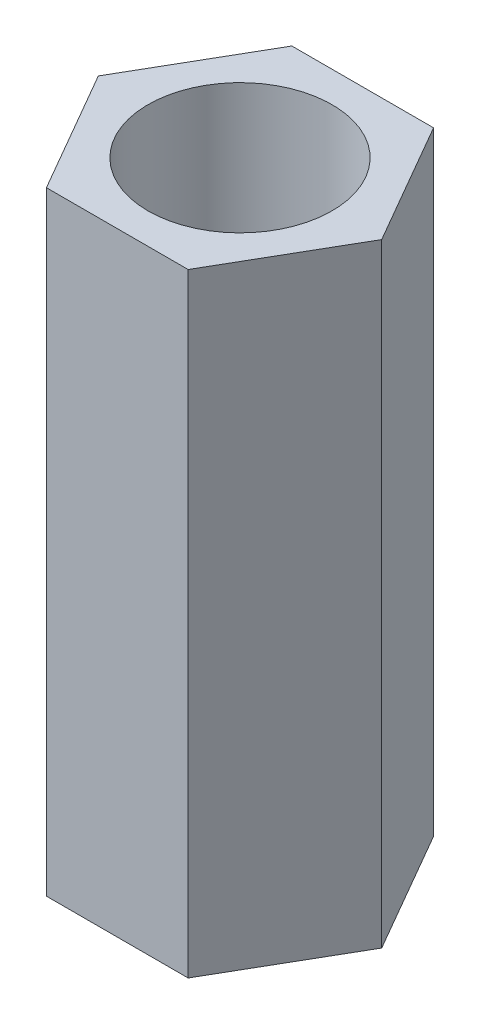
ISO-10303-21;
HEADER;
FILE_DESCRIPTION(('STEP AP214'),'2;1');
FILE_NAME('part.step','',(''),(''),'','','');
FILE_SCHEMA(('AUTOMOTIVE_DESIGN { 1 0 10303 214 1 1 1 1 }'));
ENDSEC;
DATA;
#1=APPLICATION_CONTEXT('core data for automotive mechanical design processes');
#2=APPLICATION_PROTOCOL_DEFINITION('international standard','automotive_design',2000,#1);
#3=PRODUCT_CONTEXT('',#1,'mechanical');
#4=PRODUCT('Part','Part','',(#3));
#5=PRODUCT_RELATED_PRODUCT_CATEGORY('part','',(#4));
#6=PRODUCT_DEFINITION_FORMATION('','',#4);
#7=PRODUCT_DEFINITION_CONTEXT('part definition',#1,'design');
#8=PRODUCT_DEFINITION('design','',#6,#7);
#9=PRODUCT_DEFINITION_SHAPE('','',#8);
#10=(LENGTH_UNIT() NAMED_UNIT(*) SI_UNIT(.MILLI.,.METRE.));
#11=(NAMED_UNIT(*) PLANE_ANGLE_UNIT() SI_UNIT($,.RADIAN.));
#12=(NAMED_UNIT(*) SI_UNIT($,.STERADIAN.) SOLID_ANGLE_UNIT());
#13=UNCERTAINTY_MEASURE_WITH_UNIT(LENGTH_MEASURE(1.E-05),#10,'distance_accuracy_value','');
#14=(GEOMETRIC_REPRESENTATION_CONTEXT(3) GLOBAL_UNCERTAINTY_ASSIGNED_CONTEXT((#13)) GLOBAL_UNIT_ASSIGNED_CONTEXT((#10,
#11,#12)) REPRESENTATION_CONTEXT('',''));
#15=CARTESIAN_POINT('',(0.,0.,0.));
#16=DIRECTION('',(0.,0.,1.));
#17=DIRECTION('',(1.,0.,0.));
#18=AXIS2_PLACEMENT_3D('',#15,#16,#17);
#19=CARTESIAN_POINT('',(1.15470053837927,10.,1.99999999999998));
#20=DIRECTION('',(-0.866025403784442,0.,-0.499999999999995));
#21=DIRECTION('',(-0.499999999999995,0.,0.866025403784442));
#22=AXIS2_PLACEMENT_3D('',#19,#20,#21);
#23=PLANE('',#22);
#24=DIRECTION('',(0.499999999999995,0.,-0.866025403784442));
#25=VECTOR('',#24,1.);
#26=CARTESIAN_POINT('',(1.15470053837927,0.,1.99999999999998));
#27=LINE('',#26,#25);
#28=CARTESIAN_POINT('',(1.15470053837927,0.,1.99999999999998));
#29=VERTEX_POINT('',#28);
#30=CARTESIAN_POINT('',(2.3094010767585,0.,0.));
#31=VERTEX_POINT('',#30);
#32=EDGE_CURVE('E118',#29,#31,#27,.T.);
#33=ORIENTED_EDGE('',*,*,#32,.T.);
#34=DIRECTION('',(0.,-1.,0.));
#35=VECTOR('',#34,1.);
#36=CARTESIAN_POINT('',(2.3094010767585,10.,0.));
#37=LINE('',#36,#35);
#38=CARTESIAN_POINT('',(2.3094010767585,10.,0.));
#39=VERTEX_POINT('',#38);
#40=EDGE_CURVE('E11',#39,#31,#37,.T.);
#41=ORIENTED_EDGE('',*,*,#40,.F.);
#42=DIRECTION('',(0.499999999999995,0.,-0.866025403784442));
#43=VECTOR('',#42,1.);
#44=CARTESIAN_POINT('',(1.15470053837927,10.,1.99999999999998));
#45=LINE('',#44,#43);
#46=CARTESIAN_POINT('',(1.15470053837927,10.,1.99999999999998));
#47=VERTEX_POINT('',#46);
#48=EDGE_CURVE('E129',#47,#39,#45,.T.);
#49=ORIENTED_EDGE('',*,*,#48,.F.);
#50=DIRECTION('',(0.,-1.,0.));
#51=VECTOR('',#50,1.);
#52=CARTESIAN_POINT('',(1.15470053837927,10.,1.99999999999998));
#53=LINE('',#52,#51);
#54=EDGE_CURVE('E114',#47,#29,#53,.T.);
#55=ORIENTED_EDGE('',*,*,#54,.T.);
#56=EDGE_LOOP('',(#33,#41,#49,#55));
#57=FACE_BOUND('',#56,.T.);
#58=ADVANCED_FACE('F34',(#57),#23,.F.);
#59=CARTESIAN_POINT('',(2.3094010767585,10.,0.));
#60=DIRECTION('',(-0.866025403784438,0.,0.500000000000001));
#61=DIRECTION('',(0.500000000000001,0.,0.866025403784438));
#62=AXIS2_PLACEMENT_3D('',#59,#60,#61);
#63=PLANE('',#62);
#64=DIRECTION('',(-0.500000000000001,0.,-0.866025403784438));
#65=VECTOR('',#64,1.);
#66=CARTESIAN_POINT('',(2.3094010767585,0.,0.));
#67=LINE('',#66,#65);
#68=CARTESIAN_POINT('',(1.15470053837924,0.,-2.));
#69=VERTEX_POINT('',#68);
#70=EDGE_CURVE('E121',#31,#69,#67,.T.);
#71=ORIENTED_EDGE('',*,*,#70,.T.);
#72=DIRECTION('',(0.,-1.,0.));
#73=VECTOR('',#72,1.);
#74=CARTESIAN_POINT('',(1.15470053837924,10.,-2.));
#75=LINE('',#74,#73);
#76=CARTESIAN_POINT('',(1.15470053837924,10.,-2.));
#77=VERTEX_POINT('',#76);
#78=EDGE_CURVE('E42',#77,#69,#75,.T.);
#79=ORIENTED_EDGE('',*,*,#78,.F.);
#80=DIRECTION('',(-0.500000000000001,0.,-0.866025403784438));
#81=VECTOR('',#80,1.);
#82=CARTESIAN_POINT('',(2.3094010767585,10.,0.));
#83=LINE('',#82,#81);
#84=EDGE_CURVE('E87',#39,#77,#83,.T.);
#85=ORIENTED_EDGE('',*,*,#84,.F.);
#86=ORIENTED_EDGE('',*,*,#40,.T.);
#87=EDGE_LOOP('',(#71,#79,#85,#86));
#88=FACE_BOUND('',#87,.T.);
#89=ADVANCED_FACE('F154',(#88),#63,.F.);
#90=CARTESIAN_POINT('',(1.15470053837924,10.,-2.));
#91=DIRECTION('',(0.,0.,1.));
#92=DIRECTION('',(1.,0.,0.));
#93=AXIS2_PLACEMENT_3D('',#90,#91,#92);
#94=PLANE('',#93);
#95=DIRECTION('',(-1.,0.,0.));
#96=VECTOR('',#95,1.);
#97=CARTESIAN_POINT('',(1.15470053837924,0.,-2.));
#98=LINE('',#97,#96);
#99=CARTESIAN_POINT('',(-1.15470053837926,0.,-1.99999999999999));
#100=VERTEX_POINT('',#99);
#101=EDGE_CURVE('E124',#69,#100,#98,.T.);
#102=ORIENTED_EDGE('',*,*,#101,.T.);
#103=DIRECTION('',(0.,-1.,0.));
#104=VECTOR('',#103,1.);
#105=CARTESIAN_POINT('',(-1.15470053837926,10.,-1.99999999999999));
#106=LINE('',#105,#104);
#107=CARTESIAN_POINT('',(-1.15470053837926,10.,-1.99999999999999));
#108=VERTEX_POINT('',#107);
#109=EDGE_CURVE('E109',#108,#100,#106,.T.);
#110=ORIENTED_EDGE('',*,*,#109,.F.);
#111=DIRECTION('',(-1.,0.,0.));
#112=VECTOR('',#111,1.);
#113=CARTESIAN_POINT('',(1.15470053837924,10.,-2.));
#114=LINE('',#113,#112);
#115=EDGE_CURVE('E100',#77,#108,#114,.T.);
#116=ORIENTED_EDGE('',*,*,#115,.F.);
#117=ORIENTED_EDGE('',*,*,#78,.T.);
#118=EDGE_LOOP('',(#102,#110,#116,#117));
#119=FACE_BOUND('',#118,.T.);
#120=ADVANCED_FACE('F135',(#119),#94,.F.);
#121=CARTESIAN_POINT('',(-1.15470053837926,10.,-1.99999999999999));
#122=DIRECTION('',(0.866025403784442,0.,0.499999999999995));
#123=DIRECTION('',(0.499999999999995,0.,-0.866025403784442));
#124=AXIS2_PLACEMENT_3D('',#121,#122,#123);
#125=PLANE('',#124);
#126=DIRECTION('',(-0.499999999999995,0.,0.866025403784442));
#127=VECTOR('',#126,1.);
#128=CARTESIAN_POINT('',(-1.15470053837926,0.,-1.99999999999999));
#129=LINE('',#128,#127);
#130=CARTESIAN_POINT('',(-2.3094010767585,0.,0.));
#131=VERTEX_POINT('',#130);
#132=EDGE_CURVE('E108',#100,#131,#129,.T.);
#133=ORIENTED_EDGE('',*,*,#132,.T.);
#134=DIRECTION('',(0.,-1.,0.));
#135=VECTOR('',#134,1.);
#136=CARTESIAN_POINT('',(-2.3094010767585,10.,0.));
#137=LINE('',#136,#135);
#138=CARTESIAN_POINT('',(-2.3094010767585,10.,0.));
#139=VERTEX_POINT('',#138);
#140=EDGE_CURVE('E105',#139,#131,#137,.T.);
#141=ORIENTED_EDGE('',*,*,#140,.F.);
#142=DIRECTION('',(-0.499999999999995,0.,0.866025403784442));
#143=VECTOR('',#142,1.);
#144=CARTESIAN_POINT('',(-1.15470053837926,10.,-1.99999999999999));
#145=LINE('',#144,#143);
#146=EDGE_CURVE('E94',#108,#139,#145,.T.);
#147=ORIENTED_EDGE('',*,*,#146,.F.);
#148=ORIENTED_EDGE('',*,*,#109,.T.);
#149=EDGE_LOOP('',(#133,#141,#147,#148));
#150=FACE_BOUND('',#149,.T.);
#151=ADVANCED_FACE('F106',(#150),#125,.F.);
#152=CARTESIAN_POINT('',(-2.3094010767585,10.,0.));
#153=DIRECTION('',(0.866025403784435,0.,-0.500000000000007));
#154=DIRECTION('',(-0.500000000000007,0.,-0.866025403784435));
#155=AXIS2_PLACEMENT_3D('',#152,#153,#154);
#156=PLANE('',#155);
#157=DIRECTION('',(0.500000000000007,0.,0.866025403784435));
#158=VECTOR('',#157,1.);
#159=CARTESIAN_POINT('',(-2.3094010767585,0.,0.));
#160=LINE('',#159,#158);
#161=CARTESIAN_POINT('',(-1.15470053837923,0.,2.));
#162=VERTEX_POINT('',#161);
#163=EDGE_CURVE('E73',#131,#162,#160,.T.);
#164=ORIENTED_EDGE('',*,*,#163,.T.);
#165=DIRECTION('',(0.,-1.,0.));
#166=VECTOR('',#165,1.);
#167=CARTESIAN_POINT('',(-1.15470053837923,10.,2.));
#168=LINE('',#167,#166);
#169=CARTESIAN_POINT('',(-1.15470053837923,10.,2.));
#170=VERTEX_POINT('',#169);
#171=EDGE_CURVE('E110',#170,#162,#168,.T.);
#172=ORIENTED_EDGE('',*,*,#171,.F.);
#173=DIRECTION('',(0.500000000000007,0.,0.866025403784435));
#174=VECTOR('',#173,1.);
#175=CARTESIAN_POINT('',(-2.3094010767585,10.,0.));
#176=LINE('',#175,#174);
#177=EDGE_CURVE('E98',#139,#170,#176,.T.);
#178=ORIENTED_EDGE('',*,*,#177,.F.);
#179=ORIENTED_EDGE('',*,*,#140,.T.);
#180=EDGE_LOOP('',(#164,#172,#178,#179));
#181=FACE_BOUND('',#180,.T.);
#182=ADVANCED_FACE('F112',(#181),#156,.F.);
#183=CARTESIAN_POINT('',(-1.15470053837923,10.,2.));
#184=DIRECTION('',(0.,0.,-1.));
#185=DIRECTION('',(-1.,0.,0.));
#186=AXIS2_PLACEMENT_3D('',#183,#184,#185);
#187=PLANE('',#186);
#188=DIRECTION('',(1.,0.,0.));
#189=VECTOR('',#188,1.);
#190=CARTESIAN_POINT('',(-1.15470053837923,0.,2.));
#191=LINE('',#190,#189);
#192=EDGE_CURVE('E79',#162,#29,#191,.T.);
#193=ORIENTED_EDGE('',*,*,#192,.T.);
#194=ORIENTED_EDGE('',*,*,#54,.F.);
#195=DIRECTION('',(1.,0.,0.));
#196=VECTOR('',#195,1.);
#197=CARTESIAN_POINT('',(-1.15470053837923,10.,2.));
#198=LINE('',#197,#196);
#199=EDGE_CURVE('E50',#170,#47,#198,.T.);
#200=ORIENTED_EDGE('',*,*,#199,.F.);
#201=ORIENTED_EDGE('',*,*,#171,.T.);
#202=EDGE_LOOP('',(#193,#194,#200,#201));
#203=FACE_BOUND('',#202,.T.);
#204=ADVANCED_FACE('F142',(#203),#187,.F.);
#205=CARTESIAN_POINT('',(0.,10.,0.));
#206=DIRECTION('',(0.,1.,0.));
#207=DIRECTION('',(0.,0.,1.));
#208=AXIS2_PLACEMENT_3D('',#205,#206,#207);
#209=PLANE('',#208);
#210=CARTESIAN_POINT('',(0.,10.,0.));
#211=DIRECTION('',(0.,1.,0.));
#212=DIRECTION('',(0.,0.,1.));
#213=AXIS2_PLACEMENT_3D('',#210,#211,#212);
#214=CIRCLE('',#213,1.5);
#215=CARTESIAN_POINT('',(0.,10.,1.5));
#216=VERTEX_POINT('',#215);
#217=EDGE_CURVE('E209',#216,#216,#214,.T.);
#218=ORIENTED_EDGE('',*,*,#217,.F.);
#219=EDGE_LOOP('',(#218));
#220=FACE_BOUND('',#219,.T.);
#221=ORIENTED_EDGE('',*,*,#48,.T.);
#222=ORIENTED_EDGE('',*,*,#84,.T.);
#223=ORIENTED_EDGE('',*,*,#115,.T.);
#224=ORIENTED_EDGE('',*,*,#146,.T.);
#225=ORIENTED_EDGE('',*,*,#177,.T.);
#226=ORIENTED_EDGE('',*,*,#199,.T.);
#227=EDGE_LOOP('',(#221,#222,#223,#224,#225,#226));
#228=FACE_BOUND('',#227,.T.);
#229=ADVANCED_FACE('F96',(#220,#228),#209,.T.);
#230=CARTESIAN_POINT('',(0.,0.,0.));
#231=DIRECTION('',(0.,1.,0.));
#232=DIRECTION('',(0.,0.,1.));
#233=AXIS2_PLACEMENT_3D('',#230,#231,#232);
#234=PLANE('',#233);
#235=CARTESIAN_POINT('',(0.,0.,0.));
#236=DIRECTION('',(0.,1.,0.));
#237=DIRECTION('',(0.,0.,1.));
#238=AXIS2_PLACEMENT_3D('',#235,#236,#237);
#239=CIRCLE('',#238,1.5);
#240=CARTESIAN_POINT('',(0.,0.,1.5));
#241=VERTEX_POINT('',#240);
#242=EDGE_CURVE('E122',#241,#241,#239,.T.);
#243=ORIENTED_EDGE('',*,*,#242,.T.);
#244=EDGE_LOOP('',(#243));
#245=FACE_BOUND('',#244,.T.);
#246=ORIENTED_EDGE('',*,*,#32,.F.);
#247=ORIENTED_EDGE('',*,*,#192,.F.);
#248=ORIENTED_EDGE('',*,*,#163,.F.);
#249=ORIENTED_EDGE('',*,*,#132,.F.);
#250=ORIENTED_EDGE('',*,*,#101,.F.);
#251=ORIENTED_EDGE('',*,*,#70,.F.);
#252=EDGE_LOOP('',(#246,#247,#248,#249,#250,#251));
#253=FACE_BOUND('',#252,.T.);
#254=ADVANCED_FACE('F138',(#245,#253),#234,.F.);
#255=CARTESIAN_POINT('',(0.,0.,0.));
#256=DIRECTION('',(0.,1.,0.));
#257=DIRECTION('',(0.,0.,1.));
#258=AXIS2_PLACEMENT_3D('',#255,#256,#257);
#259=CYLINDRICAL_SURFACE('',#258,1.5);
#260=ORIENTED_EDGE('',*,*,#242,.F.);
#261=EDGE_LOOP('',(#260));
#262=FACE_BOUND('',#261,.T.);
#263=ORIENTED_EDGE('',*,*,#217,.T.);
#264=EDGE_LOOP('',(#263));
#265=FACE_BOUND('',#264,.T.);
#266=ADVANCED_FACE('F191',(#262,#265),#259,.F.);
#267=CLOSED_SHELL('',(#58,#89,#120,#151,#182,#204,#229,#254,#266));
#268=MANIFOLD_SOLID_BREP('B2',#267);
#269=ADVANCED_BREP_SHAPE_REPRESENTATION('',(#18,#268),#14);
#270=SHAPE_DEFINITION_REPRESENTATION(#9,#269);
ENDSEC;
END-ISO-10303-21;
